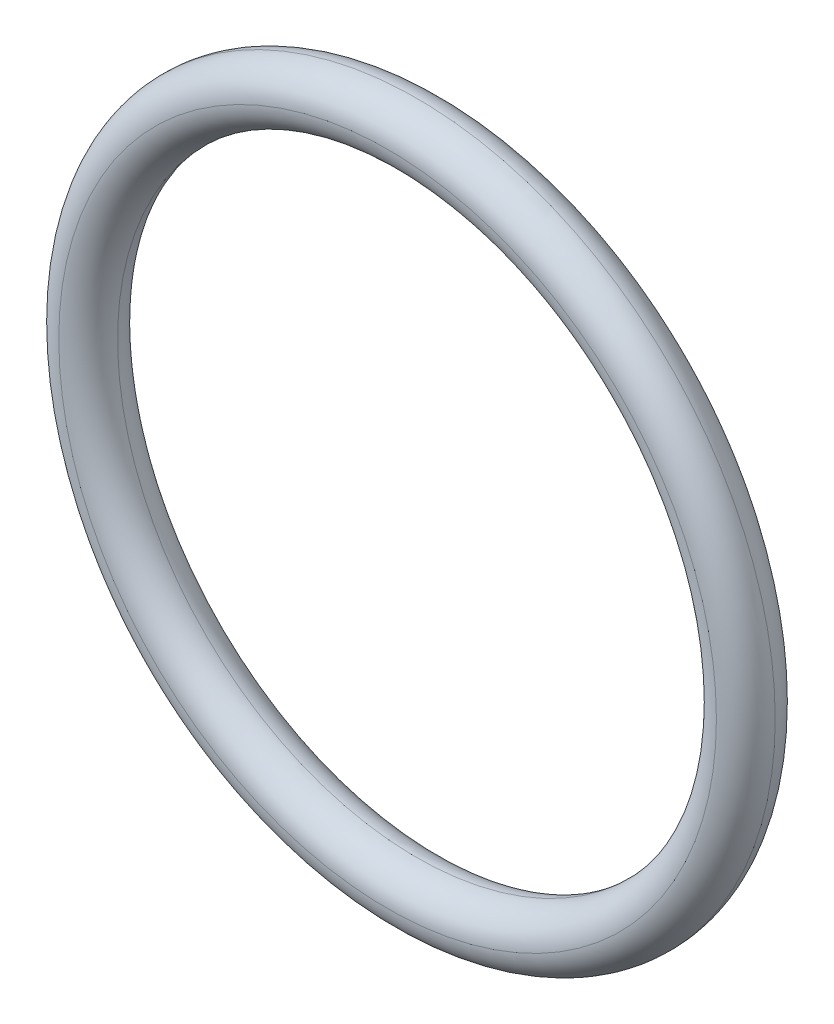
ISO-10303-21;
HEADER;
FILE_DESCRIPTION(('STEP AP214'),'2;1');
FILE_NAME('part.step','',(''),(''),'','','');
FILE_SCHEMA(('AUTOMOTIVE_DESIGN { 1 0 10303 214 1 1 1 1 }'));
ENDSEC;
DATA;
#1=APPLICATION_CONTEXT('core data for automotive mechanical design processes');
#2=APPLICATION_PROTOCOL_DEFINITION('international standard','automotive_design',2000,#1);
#3=PRODUCT_CONTEXT('',#1,'mechanical');
#4=PRODUCT('Part','Part','',(#3));
#5=PRODUCT_RELATED_PRODUCT_CATEGORY('part','',(#4));
#6=PRODUCT_DEFINITION_FORMATION('','',#4);
#7=PRODUCT_DEFINITION_CONTEXT('part definition',#1,'design');
#8=PRODUCT_DEFINITION('design','',#6,#7);
#9=PRODUCT_DEFINITION_SHAPE('','',#8);
#10=(LENGTH_UNIT() NAMED_UNIT(*) SI_UNIT(.MILLI.,.METRE.));
#11=(NAMED_UNIT(*) PLANE_ANGLE_UNIT() SI_UNIT($,.RADIAN.));
#12=(NAMED_UNIT(*) SI_UNIT($,.STERADIAN.) SOLID_ANGLE_UNIT());
#13=UNCERTAINTY_MEASURE_WITH_UNIT(LENGTH_MEASURE(1.E-05),#10,'distance_accuracy_value','');
#14=(GEOMETRIC_REPRESENTATION_CONTEXT(3) GLOBAL_UNCERTAINTY_ASSIGNED_CONTEXT((#13)) GLOBAL_UNIT_ASSIGNED_CONTEXT((#10,
#11,#12)) REPRESENTATION_CONTEXT('',''));
#15=CARTESIAN_POINT('',(0.,0.,0.));
#16=DIRECTION('',(0.,0.,1.));
#17=DIRECTION('',(1.,0.,0.));
#18=AXIS2_PLACEMENT_3D('',#15,#16,#17);
#19=CARTESIAN_POINT('',(0.,0.,3.048));
#20=DIRECTION('',(0.,0.,1.));
#21=DIRECTION('',(1.,0.,0.));
#22=AXIS2_PLACEMENT_3D('',#19,#20,#21);
#23=TOROIDAL_SURFACE('',#22,34.0995,3.048);
#24=CARTESIAN_POINT('',(0.,0.,3.048));
#25=DIRECTION('',(0.,0.,1.));
#26=DIRECTION('',(1.,0.,0.));
#27=AXIS2_PLACEMENT_3D('',#24,#25,#26);
#28=CIRCLE('',#27,37.1475);
#29=CARTESIAN_POINT('',(37.1475,0.,3.048));
#30=VERTEX_POINT('',#29);
#31=EDGE_CURVE('E40',#30,#30,#28,.F.);
#32=ORIENTED_EDGE('',*,*,#31,.F.);
#33=EDGE_LOOP('',(#32));
#34=FACE_BOUND('',#33,.T.);
#35=CARTESIAN_POINT('',(0.,0.,6.096));
#36=DIRECTION('',(0.,0.,1.));
#37=DIRECTION('',(1.,0.,0.));
#38=AXIS2_PLACEMENT_3D('',#35,#36,#37);
#39=CIRCLE('',#38,34.0995);
#40=CARTESIAN_POINT('',(34.0995,0.,6.096));
#41=VERTEX_POINT('',#40);
#42=EDGE_CURVE('E10',#41,#41,#39,.T.);
#43=ORIENTED_EDGE('',*,*,#42,.F.);
#44=EDGE_LOOP('',(#43));
#45=FACE_BOUND('',#44,.T.);
#46=ADVANCED_FACE('F34',(#34,#45),#23,.T.);
#47=CARTESIAN_POINT('',(0.,0.,3.048));
#48=DIRECTION('',(0.,0.,1.));
#49=DIRECTION('',(1.,0.,0.));
#50=AXIS2_PLACEMENT_3D('',#47,#48,#49);
#51=TOROIDAL_SURFACE('',#50,34.0995,3.048);
#52=ORIENTED_EDGE('',*,*,#42,.T.);
#53=EDGE_LOOP('',(#52));
#54=FACE_BOUND('',#53,.T.);
#55=CARTESIAN_POINT('',(0.,0.,3.048));
#56=DIRECTION('',(0.,0.,1.));
#57=DIRECTION('',(1.,0.,0.));
#58=AXIS2_PLACEMENT_3D('',#55,#56,#57);
#59=CIRCLE('',#58,31.0515);
#60=CARTESIAN_POINT('',(31.0515,0.,3.048));
#61=VERTEX_POINT('',#60);
#62=EDGE_CURVE('E44',#61,#61,#59,.T.);
#63=ORIENTED_EDGE('',*,*,#62,.F.);
#64=EDGE_LOOP('',(#63));
#65=FACE_BOUND('',#64,.T.);
#66=ADVANCED_FACE('F58',(#54,#65),#51,.T.);
#67=CARTESIAN_POINT('',(0.,0.,3.048));
#68=DIRECTION('',(0.,0.,1.));
#69=DIRECTION('',(1.,0.,0.));
#70=AXIS2_PLACEMENT_3D('',#67,#68,#69);
#71=TOROIDAL_SURFACE('',#70,34.0995,3.048);
#72=ORIENTED_EDGE('',*,*,#31,.T.);
#73=EDGE_LOOP('',(#72));
#74=FACE_BOUND('',#73,.T.);
#75=CARTESIAN_POINT('',(0.,0.,0.));
#76=DIRECTION('',(0.,0.,1.));
#77=DIRECTION('',(1.,0.,0.));
#78=AXIS2_PLACEMENT_3D('',#75,#76,#77);
#79=CIRCLE('',#78,34.0995);
#80=CARTESIAN_POINT('',(34.0995,0.,0.));
#81=VERTEX_POINT('',#80);
#82=EDGE_CURVE('E48',#81,#81,#79,.F.);
#83=ORIENTED_EDGE('',*,*,#82,.F.);
#84=EDGE_LOOP('',(#83));
#85=FACE_BOUND('',#84,.T.);
#86=ADVANCED_FACE('F56',(#74,#85),#71,.T.);
#87=CARTESIAN_POINT('',(0.,0.,3.048));
#88=DIRECTION('',(0.,0.,1.));
#89=DIRECTION('',(1.,0.,0.));
#90=AXIS2_PLACEMENT_3D('',#87,#88,#89);
#91=TOROIDAL_SURFACE('',#90,34.0995,3.048);
#92=ORIENTED_EDGE('',*,*,#62,.T.);
#93=EDGE_LOOP('',(#92));
#94=FACE_BOUND('',#93,.T.);
#95=ORIENTED_EDGE('',*,*,#82,.T.);
#96=EDGE_LOOP('',(#95));
#97=FACE_BOUND('',#96,.T.);
#98=ADVANCED_FACE('F54',(#94,#97),#91,.T.);
#99=CLOSED_SHELL('',(#46,#66,#86,#98));
#100=MANIFOLD_SOLID_BREP('B2',#99);
#101=ADVANCED_BREP_SHAPE_REPRESENTATION('',(#18,#100),#14);
#102=SHAPE_DEFINITION_REPRESENTATION(#9,#101);
ENDSEC;
END-ISO-10303-21;
